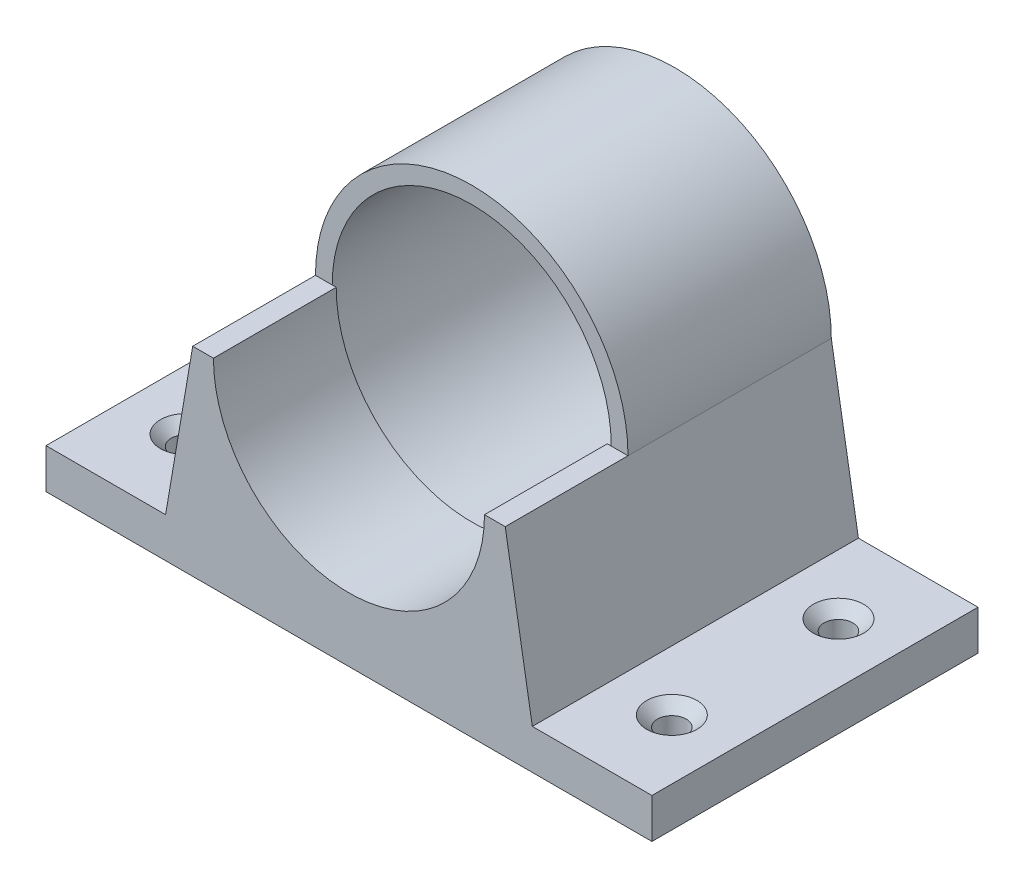
ISO-10303-21;
HEADER;
FILE_DESCRIPTION(('STEP AP214'),'2;1');
FILE_NAME('part.step','',(''),(''),'','','');
FILE_SCHEMA(('AUTOMOTIVE_DESIGN { 1 0 10303 214 1 1 1 1 }'));
ENDSEC;
DATA;
#1=APPLICATION_CONTEXT('core data for automotive mechanical design processes');
#2=APPLICATION_PROTOCOL_DEFINITION('international standard','automotive_design',2000,#1);
#3=PRODUCT_CONTEXT('',#1,'mechanical');
#4=PRODUCT('Part','Part','',(#3));
#5=PRODUCT_RELATED_PRODUCT_CATEGORY('part','',(#4));
#6=PRODUCT_DEFINITION_FORMATION('','',#4);
#7=PRODUCT_DEFINITION_CONTEXT('part definition',#1,'design');
#8=PRODUCT_DEFINITION('design','',#6,#7);
#9=PRODUCT_DEFINITION_SHAPE('','',#8);
#10=(LENGTH_UNIT() NAMED_UNIT(*) SI_UNIT(.MILLI.,.METRE.));
#11=(NAMED_UNIT(*) PLANE_ANGLE_UNIT() SI_UNIT($,.RADIAN.));
#12=(NAMED_UNIT(*) SI_UNIT($,.STERADIAN.) SOLID_ANGLE_UNIT());
#13=UNCERTAINTY_MEASURE_WITH_UNIT(LENGTH_MEASURE(1.E-05),#10,'distance_accuracy_value','');
#14=(GEOMETRIC_REPRESENTATION_CONTEXT(3) GLOBAL_UNCERTAINTY_ASSIGNED_CONTEXT((#13)) GLOBAL_UNIT_ASSIGNED_CONTEXT((#10,
#11,#12)) REPRESENTATION_CONTEXT('',''));
#15=CARTESIAN_POINT('',(0.,0.,0.));
#16=DIRECTION('',(0.,0.,1.));
#17=DIRECTION('',(1.,0.,0.));
#18=AXIS2_PLACEMENT_3D('',#15,#16,#17);
#19=CARTESIAN_POINT('',(0.,18.1533956791324,0.));
#20=DIRECTION('',(0.,0.,-1.));
#21=DIRECTION('',(-1.,0.,0.));
#22=AXIS2_PLACEMENT_3D('',#19,#20,#21);
#23=PLANE('',#22);
#24=CARTESIAN_POINT('',(0.,18.1533956791324,0.));
#25=DIRECTION('',(0.,0.,1.));
#26=DIRECTION('',(1.,0.,0.));
#27=AXIS2_PLACEMENT_3D('',#24,#25,#26);
#28=CIRCLE('',#27,17.5);
#29=CARTESIAN_POINT('',(17.5,18.1533956791324,0.));
#30=VERTEX_POINT('',#29);
#31=CARTESIAN_POINT('',(-17.5,18.1533956791324,0.));
#32=VERTEX_POINT('',#31);
#33=EDGE_CURVE('E225',#30,#32,#28,.T.);
#34=ORIENTED_EDGE('',*,*,#33,.F.);
#35=DIRECTION('',(1.,0.,0.));
#36=VECTOR('',#35,1.);
#37=CARTESIAN_POINT('',(0.,18.1533956791324,0.));
#38=LINE('',#37,#36);
#39=CARTESIAN_POINT('',(19.6,18.1533956791324,0.));
#40=VERTEX_POINT('',#39);
#41=EDGE_CURVE('E257',#30,#40,#38,.T.);
#42=ORIENTED_EDGE('',*,*,#41,.T.);
#43=CARTESIAN_POINT('',(0.,18.1533956791324,0.));
#44=DIRECTION('',(0.,0.,1.));
#45=DIRECTION('',(1.,0.,0.));
#46=AXIS2_PLACEMENT_3D('',#43,#44,#45);
#47=CIRCLE('',#46,19.6);
#48=CARTESIAN_POINT('',(-19.6,18.1533956791324,0.));
#49=VERTEX_POINT('',#48);
#50=EDGE_CURVE('E245',#40,#49,#47,.T.);
#51=ORIENTED_EDGE('',*,*,#50,.T.);
#52=DIRECTION('',(1.,0.,0.));
#53=VECTOR('',#52,1.);
#54=CARTESIAN_POINT('',(0.,18.1533956791324,0.));
#55=LINE('',#54,#53);
#56=EDGE_CURVE('E255',#49,#32,#55,.T.);
#57=ORIENTED_EDGE('',*,*,#56,.T.);
#58=EDGE_LOOP('',(#34,#42,#51,#57));
#59=FACE_BOUND('',#58,.T.);
#60=ADVANCED_FACE('F51',(#59),#23,.F.);
#61=CARTESIAN_POINT('',(0.,18.1533956791324,-25.5));
#62=DIRECTION('',(0.,0.,1.));
#63=DIRECTION('',(1.,0.,0.));
#64=AXIS2_PLACEMENT_3D('',#61,#62,#63);
#65=CYLINDRICAL_SURFACE('',#64,19.6);
#66=DIRECTION('',(0.,0.,-1.));
#67=VECTOR('',#66,1.);
#68=CARTESIAN_POINT('',(-19.6,18.1533956791324,15.4));
#69=LINE('',#68,#67);
#70=CARTESIAN_POINT('',(-19.6,18.1533956791324,-25.5));
#71=VERTEX_POINT('',#70);
#72=EDGE_CURVE('E226',#49,#71,#69,.T.);
#73=ORIENTED_EDGE('',*,*,#72,.F.);
#74=ORIENTED_EDGE('',*,*,#50,.F.);
#75=DIRECTION('',(0.,0.,-1.));
#76=VECTOR('',#75,1.);
#77=CARTESIAN_POINT('',(19.6,18.1533956791324,15.4));
#78=LINE('',#77,#76);
#79=CARTESIAN_POINT('',(19.6,18.1533956791324,-25.5));
#80=VERTEX_POINT('',#79);
#81=EDGE_CURVE('E222',#40,#80,#78,.T.);
#82=ORIENTED_EDGE('',*,*,#81,.T.);
#83=CARTESIAN_POINT('',(0.,18.1533956791324,-25.5));
#84=DIRECTION('',(0.,0.,-1.));
#85=DIRECTION('',(-1.,0.,0.));
#86=AXIS2_PLACEMENT_3D('',#83,#84,#85);
#87=CIRCLE('',#86,19.6);
#88=EDGE_CURVE('E154',#71,#80,#87,.T.);
#89=ORIENTED_EDGE('',*,*,#88,.F.);
#90=EDGE_LOOP('',(#73,#74,#82,#89));
#91=FACE_BOUND('',#90,.T.);
#92=ADVANCED_FACE('F53',(#91),#65,.T.);
#93=CARTESIAN_POINT('',(0.,18.1533956791324,-25.5));
#94=DIRECTION('',(0.,0.,-1.));
#95=DIRECTION('',(-1.,0.,0.));
#96=AXIS2_PLACEMENT_3D('',#93,#94,#95);
#97=PLANE('',#96);
#98=CARTESIAN_POINT('',(0.,18.1533956791324,-25.5));
#99=DIRECTION('',(0.,0.,1.));
#100=DIRECTION('',(1.,0.,0.));
#101=AXIS2_PLACEMENT_3D('',#98,#99,#100);
#102=CIRCLE('',#101,17.5);
#103=CARTESIAN_POINT('',(17.5,18.1533956791324,-25.5));
#104=VERTEX_POINT('',#103);
#105=EDGE_CURVE('E242',#104,#104,#102,.T.);
#106=ORIENTED_EDGE('',*,*,#105,.T.);
#107=EDGE_LOOP('',(#106));
#108=FACE_BOUND('',#107,.T.);
#109=ORIENTED_EDGE('',*,*,#88,.T.);
#110=DIRECTION('',(0.167595493933869,-0.985855846669817,0.));
#111=VECTOR('',#110,1.);
#112=CARTESIAN_POINT('',(19.6,18.1533956791324,-25.5));
#113=LINE('',#112,#111);
#114=CARTESIAN_POINT('',(23.,-1.84660432086758,-25.5));
#115=VERTEX_POINT('',#114);
#116=EDGE_CURVE('E184',#80,#115,#113,.T.);
#117=ORIENTED_EDGE('',*,*,#116,.T.);
#118=DIRECTION('',(1.,0.,0.));
#119=VECTOR('',#118,1.);
#120=CARTESIAN_POINT('',(23.,-1.84660432086758,-25.5));
#121=LINE('',#120,#119);
#122=CARTESIAN_POINT('',(38.,-1.84660432086758,-25.5));
#123=VERTEX_POINT('',#122);
#124=EDGE_CURVE('E187',#115,#123,#121,.T.);
#125=ORIENTED_EDGE('',*,*,#124,.T.);
#126=DIRECTION('',(0.,-1.,0.));
#127=VECTOR('',#126,1.);
#128=CARTESIAN_POINT('',(38.,-1.84660432086758,-25.5));
#129=LINE('',#128,#127);
#130=CARTESIAN_POINT('',(38.,-6.84660432086758,-25.5));
#131=VERTEX_POINT('',#130);
#132=EDGE_CURVE('E190',#123,#131,#129,.T.);
#133=ORIENTED_EDGE('',*,*,#132,.T.);
#134=DIRECTION('',(1.,0.,0.));
#135=VECTOR('',#134,1.);
#136=CARTESIAN_POINT('',(-38.,-6.84660432086758,-25.5));
#137=LINE('',#136,#135);
#138=CARTESIAN_POINT('',(-38.,-6.84660432086758,-25.5));
#139=VERTEX_POINT('',#138);
#140=EDGE_CURVE('E193',#139,#131,#137,.T.);
#141=ORIENTED_EDGE('',*,*,#140,.F.);
#142=DIRECTION('',(0.,-1.,0.));
#143=VECTOR('',#142,1.);
#144=CARTESIAN_POINT('',(-38.,-1.84660432086758,-25.5));
#145=LINE('',#144,#143);
#146=CARTESIAN_POINT('',(-38.,-1.84660432086758,-25.5));
#147=VERTEX_POINT('',#146);
#148=EDGE_CURVE('E196',#147,#139,#145,.T.);
#149=ORIENTED_EDGE('',*,*,#148,.F.);
#150=DIRECTION('',(-1.,0.,0.));
#151=VECTOR('',#150,1.);
#152=CARTESIAN_POINT('',(-23.,-1.84660432086758,-25.5));
#153=LINE('',#152,#151);
#154=CARTESIAN_POINT('',(-23.,-1.84660432086758,-25.5));
#155=VERTEX_POINT('',#154);
#156=EDGE_CURVE('E199',#155,#147,#153,.T.);
#157=ORIENTED_EDGE('',*,*,#156,.F.);
#158=DIRECTION('',(0.167595493933869,0.985855846669817,0.));
#159=VECTOR('',#158,1.);
#160=CARTESIAN_POINT('',(-23.,-1.84660432086758,-25.5));
#161=LINE('',#160,#159);
#162=EDGE_CURVE('E202',#155,#71,#161,.T.);
#163=ORIENTED_EDGE('',*,*,#162,.T.);
#164=EDGE_LOOP('',(#109,#117,#125,#133,#141,#149,#157,#163));
#165=FACE_BOUND('',#164,.T.);
#166=ADVANCED_FACE('F326',(#108,#165),#97,.T.);
#167=CARTESIAN_POINT('',(0.,18.1533956791324,-25.5));
#168=DIRECTION('',(0.,0.,1.));
#169=DIRECTION('',(1.,0.,0.));
#170=AXIS2_PLACEMENT_3D('',#167,#168,#169);
#171=CYLINDRICAL_SURFACE('',#170,17.5);
#172=ORIENTED_EDGE('',*,*,#105,.F.);
#173=EDGE_LOOP('',(#172));
#174=FACE_BOUND('',#173,.T.);
#175=ORIENTED_EDGE('',*,*,#33,.T.);
#176=CARTESIAN_POINT('',(0.,18.1533956791324,0.));
#177=DIRECTION('',(0.,0.,1.));
#178=DIRECTION('',(1.,0.,0.));
#179=AXIS2_PLACEMENT_3D('',#176,#177,#178);
#180=CIRCLE('',#179,17.5);
#181=EDGE_CURVE('E284',#30,#32,#180,.F.);
#182=ORIENTED_EDGE('',*,*,#181,.F.);
#183=EDGE_LOOP('',(#175,#182));
#184=FACE_BOUND('',#183,.T.);
#185=ADVANCED_FACE('F390',(#174,#184),#171,.F.);
#186=CARTESIAN_POINT('',(-23.,-1.84660432086758,15.4));
#187=DIRECTION('',(-0.985855846669818,0.167595493933869,0.));
#188=DIRECTION('',(-0.167595493933869,-0.985855846669818,0.));
#189=AXIS2_PLACEMENT_3D('',#186,#187,#188);
#190=PLANE('',#189);
#191=CARTESIAN_POINT('',(-19.6,18.1533956791324,15.4));
#192=VERTEX_POINT('',#191);
#193=EDGE_CURVE('E223',#192,#49,#69,.T.);
#194=ORIENTED_EDGE('',*,*,#193,.T.);
#195=ORIENTED_EDGE('',*,*,#72,.T.);
#196=ORIENTED_EDGE('',*,*,#162,.F.);
#197=DIRECTION('',(0.,0.,-1.));
#198=VECTOR('',#197,1.);
#199=CARTESIAN_POINT('',(-23.,-1.84660432086758,15.4));
#200=LINE('',#199,#198);
#201=CARTESIAN_POINT('',(-23.,-1.84660432086758,15.4));
#202=VERTEX_POINT('',#201);
#203=EDGE_CURVE('E227',#202,#155,#200,.T.);
#204=ORIENTED_EDGE('',*,*,#203,.F.);
#205=DIRECTION('',(0.167595493933869,0.985855846669817,0.));
#206=VECTOR('',#205,1.);
#207=CARTESIAN_POINT('',(-23.,-1.84660432086758,15.4));
#208=LINE('',#207,#206);
#209=EDGE_CURVE('E220',#202,#192,#208,.T.);
#210=ORIENTED_EDGE('',*,*,#209,.T.);
#211=EDGE_LOOP('',(#194,#195,#196,#204,#210));
#212=FACE_BOUND('',#211,.T.);
#213=ADVANCED_FACE('F313',(#212),#190,.T.);
#214=CARTESIAN_POINT('',(-23.,-1.84660432086758,15.4));
#215=DIRECTION('',(0.,-1.,0.));
#216=DIRECTION('',(1.,0.,0.));
#217=AXIS2_PLACEMENT_3D('',#214,#215,#216);
#218=PLANE('',#217);
#219=CARTESIAN_POINT('',(-30.5,-1.84660432086758,-15.5));
#220=DIRECTION('',(0.,1.,0.));
#221=DIRECTION('',(0.,0.,1.));
#222=AXIS2_PLACEMENT_3D('',#219,#220,#221);
#223=CIRCLE('',#222,3.15);
#224=CARTESIAN_POINT('',(-30.5,-1.84660432086758,-12.35));
#225=VERTEX_POINT('',#224);
#226=EDGE_CURVE('E175',#225,#225,#223,.T.);
#227=ORIENTED_EDGE('',*,*,#226,.F.);
#228=EDGE_LOOP('',(#227));
#229=FACE_BOUND('',#228,.T.);
#230=CARTESIAN_POINT('',(-30.5,-1.84660432086758,5.4));
#231=DIRECTION('',(0.,1.,0.));
#232=DIRECTION('',(0.,0.,1.));
#233=AXIS2_PLACEMENT_3D('',#230,#231,#232);
#234=CIRCLE('',#233,3.15);
#235=CARTESIAN_POINT('',(-30.5,-1.84660432086758,8.55));
#236=VERTEX_POINT('',#235);
#237=EDGE_CURVE('E168',#236,#236,#234,.T.);
#238=ORIENTED_EDGE('',*,*,#237,.F.);
#239=EDGE_LOOP('',(#238));
#240=FACE_BOUND('',#239,.T.);
#241=ORIENTED_EDGE('',*,*,#203,.T.);
#242=ORIENTED_EDGE('',*,*,#156,.T.);
#243=DIRECTION('',(0.,0.,-1.));
#244=VECTOR('',#243,1.);
#245=CARTESIAN_POINT('',(-38.,-1.84660432086758,15.4));
#246=LINE('',#245,#244);
#247=CARTESIAN_POINT('',(-38.,-1.84660432086758,15.4));
#248=VERTEX_POINT('',#247);
#249=EDGE_CURVE('E229',#248,#147,#246,.T.);
#250=ORIENTED_EDGE('',*,*,#249,.F.);
#251=DIRECTION('',(-1.,0.,0.));
#252=VECTOR('',#251,1.);
#253=CARTESIAN_POINT('',(-23.,-1.84660432086758,15.4));
#254=LINE('',#253,#252);
#255=EDGE_CURVE('E218',#202,#248,#254,.T.);
#256=ORIENTED_EDGE('',*,*,#255,.F.);
#257=EDGE_LOOP('',(#241,#242,#250,#256));
#258=FACE_BOUND('',#257,.T.);
#259=ADVANCED_FACE('F309',(#229,#240,#258),#218,.F.);
#260=CARTESIAN_POINT('',(-38.,-1.84660432086758,15.4));
#261=DIRECTION('',(1.,0.,0.));
#262=DIRECTION('',(0.,0.,-1.));
#263=AXIS2_PLACEMENT_3D('',#260,#261,#262);
#264=PLANE('',#263);
#265=ORIENTED_EDGE('',*,*,#249,.T.);
#266=ORIENTED_EDGE('',*,*,#148,.T.);
#267=DIRECTION('',(0.,0.,-1.));
#268=VECTOR('',#267,1.);
#269=CARTESIAN_POINT('',(-38.,-6.84660432086758,15.4));
#270=LINE('',#269,#268);
#271=CARTESIAN_POINT('',(-38.,-6.84660432086758,15.4));
#272=VERTEX_POINT('',#271);
#273=EDGE_CURVE('E231',#272,#139,#270,.T.);
#274=ORIENTED_EDGE('',*,*,#273,.F.);
#275=DIRECTION('',(0.,-1.,0.));
#276=VECTOR('',#275,1.);
#277=CARTESIAN_POINT('',(-38.,-1.84660432086758,15.4));
#278=LINE('',#277,#276);
#279=EDGE_CURVE('E216',#248,#272,#278,.T.);
#280=ORIENTED_EDGE('',*,*,#279,.F.);
#281=EDGE_LOOP('',(#265,#266,#274,#280));
#282=FACE_BOUND('',#281,.T.);
#283=ADVANCED_FACE('F312',(#282),#264,.F.);
#284=CARTESIAN_POINT('',(-38.,-6.84660432086758,15.4));
#285=DIRECTION('',(0.,1.,0.));
#286=DIRECTION('',(0.,0.,1.));
#287=AXIS2_PLACEMENT_3D('',#284,#285,#286);
#288=PLANE('',#287);
#289=CARTESIAN_POINT('',(30.5,-6.84660432086761,5.4));
#290=DIRECTION('',(0.,1.,0.));
#291=DIRECTION('',(0.,0.,1.));
#292=AXIS2_PLACEMENT_3D('',#289,#290,#291);
#293=CIRCLE('',#292,1.8);
#294=CARTESIAN_POINT('',(30.5,-6.84660432086761,7.2));
#295=VERTEX_POINT('',#294);
#296=EDGE_CURVE('E293',#295,#295,#293,.T.);
#297=ORIENTED_EDGE('',*,*,#296,.T.);
#298=EDGE_LOOP('',(#297));
#299=FACE_BOUND('',#298,.T.);
#300=CARTESIAN_POINT('',(30.5,-6.84660432086761,-15.5));
#301=DIRECTION('',(0.,1.,0.));
#302=DIRECTION('',(0.,0.,1.));
#303=AXIS2_PLACEMENT_3D('',#300,#301,#302);
#304=CIRCLE('',#303,1.8);
#305=CARTESIAN_POINT('',(30.5,-6.84660432086761,-13.7));
#306=VERTEX_POINT('',#305);
#307=EDGE_CURVE('E302',#306,#306,#304,.T.);
#308=ORIENTED_EDGE('',*,*,#307,.T.);
#309=EDGE_LOOP('',(#308));
#310=FACE_BOUND('',#309,.T.);
#311=CARTESIAN_POINT('',(-30.5,-6.8466043208676,-15.5));
#312=DIRECTION('',(0.,1.,0.));
#313=DIRECTION('',(0.,0.,1.));
#314=AXIS2_PLACEMENT_3D('',#311,#312,#313);
#315=CIRCLE('',#314,1.8);
#316=CARTESIAN_POINT('',(-31.6901796266558,-6.84660432081886,-14.1496398790347));
#317=VERTEX_POINT('',#316);
#318=CARTESIAN_POINT('',(-31.7573023830465,-6.8466043208676,-16.7880957718995));
#319=VERTEX_POINT('',#318);
#320=EDGE_CURVE('E163',#317,#319,#315,.T.);
#321=ORIENTED_EDGE('',*,*,#320,.T.);
#322=CARTESIAN_POINT('',(-32.9482803004892,-6.84660432086758,-15.4377153410314));
#323=DIRECTION('',(0.,1.,0.));
#324=DIRECTION('',(0.999676555950965,0.,-0.0254319382276887));
#325=AXIS2_PLACEMENT_3D('',#322,#323,#324);
#326=ELLIPSE('',#325,1.80117420355769,1.79999999999999);
#327=EDGE_CURVE('E158',#319,#317,#326,.T.);
#328=ORIENTED_EDGE('',*,*,#327,.T.);
#329=EDGE_LOOP('',(#321,#328));
#330=FACE_BOUND('',#329,.T.);
#331=CARTESIAN_POINT('',(-30.5,-6.8466043208676,5.4));
#332=DIRECTION('',(0.,1.,0.));
#333=DIRECTION('',(0.,0.,1.));
#334=AXIS2_PLACEMENT_3D('',#331,#332,#333);
#335=CIRCLE('',#334,1.8);
#336=CARTESIAN_POINT('',(-31.150132470735,-6.84660432081886,7.07848972904097));
#337=VERTEX_POINT('',#336);
#338=CARTESIAN_POINT('',(-31.2346383598517,-6.8466043208676,3.75673907116536));
#339=VERTEX_POINT('',#338);
#340=EDGE_CURVE('E181',#337,#339,#335,.T.);
#341=ORIENTED_EDGE('',*,*,#340,.T.);
#342=CARTESIAN_POINT('',(-31.885222499378,-6.84660432086758,5.43524029129845));
#343=DIRECTION('',(0.,1.,0.));
#344=DIRECTION('',(0.999676555950965,0.,-0.0254319382276887));
#345=AXIS2_PLACEMENT_3D('',#342,#343,#344);
#346=ELLIPSE('',#345,1.80117420355771,1.8);
#347=EDGE_CURVE('E164',#339,#337,#346,.T.);
#348=ORIENTED_EDGE('',*,*,#347,.T.);
#349=EDGE_LOOP('',(#341,#348));
#350=FACE_BOUND('',#349,.T.);
#351=ORIENTED_EDGE('',*,*,#273,.T.);
#352=ORIENTED_EDGE('',*,*,#140,.T.);
#353=DIRECTION('',(0.,0.,-1.));
#354=VECTOR('',#353,1.);
#355=CARTESIAN_POINT('',(38.,-6.84660432086758,15.4));
#356=LINE('',#355,#354);
#357=CARTESIAN_POINT('',(38.,-6.84660432086758,15.4));
#358=VERTEX_POINT('',#357);
#359=EDGE_CURVE('E233',#358,#131,#356,.T.);
#360=ORIENTED_EDGE('',*,*,#359,.F.);
#361=DIRECTION('',(1.,0.,0.));
#362=VECTOR('',#361,1.);
#363=CARTESIAN_POINT('',(-38.,-6.84660432086758,15.4));
#364=LINE('',#363,#362);
#365=EDGE_CURVE('E214',#272,#358,#364,.T.);
#366=ORIENTED_EDGE('',*,*,#365,.F.);
#367=EDGE_LOOP('',(#351,#352,#360,#366));
#368=FACE_BOUND('',#367,.T.);
#369=ADVANCED_FACE('F161',(#299,#310,#330,#350,#368),#288,.F.);
#370=CARTESIAN_POINT('',(38.,-1.84660432086758,15.4));
#371=DIRECTION('',(1.,0.,0.));
#372=DIRECTION('',(0.,0.,-1.));
#373=AXIS2_PLACEMENT_3D('',#370,#371,#372);
#374=PLANE('',#373);
#375=ORIENTED_EDGE('',*,*,#359,.T.);
#376=ORIENTED_EDGE('',*,*,#132,.F.);
#377=DIRECTION('',(0.,0.,-1.));
#378=VECTOR('',#377,1.);
#379=CARTESIAN_POINT('',(38.,-1.84660432086758,15.4));
#380=LINE('',#379,#378);
#381=CARTESIAN_POINT('',(38.,-1.84660432086758,15.4));
#382=VERTEX_POINT('',#381);
#383=EDGE_CURVE('E235',#382,#123,#380,.T.);
#384=ORIENTED_EDGE('',*,*,#383,.F.);
#385=DIRECTION('',(0.,-1.,0.));
#386=VECTOR('',#385,1.);
#387=CARTESIAN_POINT('',(38.,-1.84660432086758,15.4));
#388=LINE('',#387,#386);
#389=EDGE_CURVE('E211',#382,#358,#388,.T.);
#390=ORIENTED_EDGE('',*,*,#389,.T.);
#391=EDGE_LOOP('',(#375,#376,#384,#390));
#392=FACE_BOUND('',#391,.T.);
#393=ADVANCED_FACE('F343',(#392),#374,.T.);
#394=CARTESIAN_POINT('',(23.,-1.84660432086758,15.4));
#395=DIRECTION('',(0.,1.,0.));
#396=DIRECTION('',(-1.,0.,0.));
#397=AXIS2_PLACEMENT_3D('',#394,#395,#396);
#398=PLANE('',#397);
#399=CARTESIAN_POINT('',(30.5,-1.84660432086758,5.4));
#400=DIRECTION('',(0.,1.,0.));
#401=DIRECTION('',(0.,0.,1.));
#402=AXIS2_PLACEMENT_3D('',#399,#400,#401);
#403=CIRCLE('',#402,3.15);
#404=CARTESIAN_POINT('',(30.5,-1.84660432086758,8.55));
#405=VERTEX_POINT('',#404);
#406=EDGE_CURVE('E287',#405,#405,#403,.T.);
#407=ORIENTED_EDGE('',*,*,#406,.F.);
#408=EDGE_LOOP('',(#407));
#409=FACE_BOUND('',#408,.T.);
#410=CARTESIAN_POINT('',(30.5,-1.84660432086758,-15.5));
#411=DIRECTION('',(0.,1.,0.));
#412=DIRECTION('',(0.,0.,1.));
#413=AXIS2_PLACEMENT_3D('',#410,#411,#412);
#414=CIRCLE('',#413,3.15);
#415=CARTESIAN_POINT('',(30.5,-1.84660432086758,-12.35));
#416=VERTEX_POINT('',#415);
#417=EDGE_CURVE('E296',#416,#416,#414,.T.);
#418=ORIENTED_EDGE('',*,*,#417,.F.);
#419=EDGE_LOOP('',(#418));
#420=FACE_BOUND('',#419,.T.);
#421=ORIENTED_EDGE('',*,*,#383,.T.);
#422=ORIENTED_EDGE('',*,*,#124,.F.);
#423=DIRECTION('',(0.,0.,-1.));
#424=VECTOR('',#423,1.);
#425=CARTESIAN_POINT('',(23.,-1.84660432086758,15.4));
#426=LINE('',#425,#424);
#427=CARTESIAN_POINT('',(23.,-1.84660432086758,15.4));
#428=VERTEX_POINT('',#427);
#429=EDGE_CURVE('E237',#428,#115,#426,.T.);
#430=ORIENTED_EDGE('',*,*,#429,.F.);
#431=DIRECTION('',(1.,0.,0.));
#432=VECTOR('',#431,1.);
#433=CARTESIAN_POINT('',(23.,-1.84660432086758,15.4));
#434=LINE('',#433,#432);
#435=EDGE_CURVE('E208',#428,#382,#434,.T.);
#436=ORIENTED_EDGE('',*,*,#435,.T.);
#437=EDGE_LOOP('',(#421,#422,#430,#436));
#438=FACE_BOUND('',#437,.T.);
#439=ADVANCED_FACE('F340',(#409,#420,#438),#398,.T.);
#440=CARTESIAN_POINT('',(19.6,18.1533956791324,15.4));
#441=DIRECTION('',(0.985855846669818,0.167595493933869,0.));
#442=DIRECTION('',(-0.167595493933869,0.985855846669818,0.));
#443=AXIS2_PLACEMENT_3D('',#440,#441,#442);
#444=PLANE('',#443);
#445=ORIENTED_EDGE('',*,*,#429,.T.);
#446=ORIENTED_EDGE('',*,*,#116,.F.);
#447=ORIENTED_EDGE('',*,*,#81,.F.);
#448=CARTESIAN_POINT('',(19.6,18.1533956791324,15.4));
#449=VERTEX_POINT('',#448);
#450=EDGE_CURVE('E239',#449,#40,#78,.T.);
#451=ORIENTED_EDGE('',*,*,#450,.F.);
#452=DIRECTION('',(0.167595493933869,-0.985855846669817,0.));
#453=VECTOR('',#452,1.);
#454=CARTESIAN_POINT('',(19.6,18.1533956791324,15.4));
#455=LINE('',#454,#453);
#456=EDGE_CURVE('E205',#449,#428,#455,.T.);
#457=ORIENTED_EDGE('',*,*,#456,.T.);
#458=EDGE_LOOP('',(#445,#446,#447,#451,#457));
#459=FACE_BOUND('',#458,.T.);
#460=ADVANCED_FACE('F346',(#459),#444,.T.);
#461=CARTESIAN_POINT('',(0.,18.1533956791324,15.4));
#462=DIRECTION('',(0.,0.,1.));
#463=DIRECTION('',(1.,0.,0.));
#464=AXIS2_PLACEMENT_3D('',#461,#462,#463);
#465=PLANE('',#464);
#466=ORIENTED_EDGE('',*,*,#456,.F.);
#467=DIRECTION('',(1.,0.,0.));
#468=VECTOR('',#467,1.);
#469=CARTESIAN_POINT('',(0.,18.1533956791324,15.4));
#470=LINE('',#469,#468);
#471=CARTESIAN_POINT('',(17.,18.1533956791324,15.4));
#472=VERTEX_POINT('',#471);
#473=EDGE_CURVE('E270',#472,#449,#470,.T.);
#474=ORIENTED_EDGE('',*,*,#473,.F.);
#475=CARTESIAN_POINT('',(0.,18.1533956791324,15.4));
#476=DIRECTION('',(0.,0.,1.));
#477=DIRECTION('',(1.,0.,0.));
#478=AXIS2_PLACEMENT_3D('',#475,#476,#477);
#479=CIRCLE('',#478,17.);
#480=CARTESIAN_POINT('',(-17.,18.1533956791324,15.4));
#481=VERTEX_POINT('',#480);
#482=EDGE_CURVE('E273',#472,#481,#479,.F.);
#483=ORIENTED_EDGE('',*,*,#482,.T.);
#484=DIRECTION('',(1.,0.,0.));
#485=VECTOR('',#484,1.);
#486=CARTESIAN_POINT('',(0.,18.1533956791324,15.4));
#487=LINE('',#486,#485);
#488=EDGE_CURVE('E282',#192,#481,#487,.T.);
#489=ORIENTED_EDGE('',*,*,#488,.F.);
#490=ORIENTED_EDGE('',*,*,#209,.F.);
#491=ORIENTED_EDGE('',*,*,#255,.T.);
#492=ORIENTED_EDGE('',*,*,#279,.T.);
#493=ORIENTED_EDGE('',*,*,#365,.T.);
#494=ORIENTED_EDGE('',*,*,#389,.F.);
#495=ORIENTED_EDGE('',*,*,#435,.F.);
#496=EDGE_LOOP('',(#466,#474,#483,#489,#490,#491,#492,#493,#494,#495));
#497=FACE_BOUND('',#496,.T.);
#498=ADVANCED_FACE('F333',(#497),#465,.T.);
#499=CARTESIAN_POINT('',(-30.5,-1.84660432086758,5.4));
#500=DIRECTION('',(0.,1.,0.));
#501=DIRECTION('',(0.,0.,1.));
#502=AXIS2_PLACEMENT_3D('',#499,#500,#501);
#503=CYLINDRICAL_SURFACE('',#502,1.8);
#504=ORIENTED_EDGE('',*,*,#340,.F.);
#505=CARTESIAN_POINT('',(-30.5,-6.87162560873723,5.4));
#506=DIRECTION('',(0.0360908865319125,0.999348089954104,-0.000918158169658168));
#507=DIRECTION('',(-0.999024856761494,0.0361025636912934,0.0254153588916714));
#508=AXIS2_PLACEMENT_3D('',#505,#506,#507);
#509=ELLIPSE('',#508,1.80117420355771,1.8);
#510=EDGE_CURVE('E12',#337,#339,#509,.F.);
#511=ORIENTED_EDGE('',*,*,#510,.T.);
#512=EDGE_LOOP('',(#504,#511));
#513=FACE_BOUND('',#512,.T.);
#514=CARTESIAN_POINT('',(-30.5,-3.19660432086758,5.4));
#515=DIRECTION('',(0.,1.,0.));
#516=DIRECTION('',(0.,0.,1.));
#517=AXIS2_PLACEMENT_3D('',#514,#515,#516);
#518=CIRCLE('',#517,1.8);
#519=CARTESIAN_POINT('',(-30.5,-3.19660432086758,7.2));
#520=VERTEX_POINT('',#519);
#521=EDGE_CURVE('E172',#520,#520,#518,.T.);
#522=ORIENTED_EDGE('',*,*,#521,.T.);
#523=EDGE_LOOP('',(#522));
#524=FACE_BOUND('',#523,.T.);
#525=ADVANCED_FACE('F368',(#513,#524),#503,.F.);
#526=CARTESIAN_POINT('',(-30.5,-1.84660432086758,5.4));
#527=DIRECTION('',(0.,1.,0.));
#528=DIRECTION('',(0.,0.,1.));
#529=AXIS2_PLACEMENT_3D('',#526,#527,#528);
#530=CONICAL_SURFACE('',#529,3.15,0.785398163397448);
#531=ORIENTED_EDGE('',*,*,#521,.F.);
#532=EDGE_LOOP('',(#531));
#533=FACE_BOUND('',#532,.T.);
#534=ORIENTED_EDGE('',*,*,#237,.T.);
#535=EDGE_LOOP('',(#534));
#536=FACE_BOUND('',#535,.T.);
#537=ADVANCED_FACE('F428',(#533,#536),#530,.F.);
#538=CARTESIAN_POINT('',(-30.5,-1.84660432086758,-15.5));
#539=DIRECTION('',(0.,1.,0.));
#540=DIRECTION('',(0.,0.,1.));
#541=AXIS2_PLACEMENT_3D('',#538,#539,#540);
#542=CYLINDRICAL_SURFACE('',#541,1.8);
#543=ORIENTED_EDGE('',*,*,#320,.F.);
#544=CARTESIAN_POINT('',(-30.5,-6.89082763247526,-15.5));
#545=DIRECTION('',(0.0360908865319125,0.999348089954104,-0.000918158169658168));
#546=DIRECTION('',(-0.999024856761494,0.0361025636912934,0.0254153588916714));
#547=AXIS2_PLACEMENT_3D('',#544,#545,#546);
#548=ELLIPSE('',#547,1.80117420355771,1.8);
#549=EDGE_CURVE('E59',#317,#319,#548,.F.);
#550=ORIENTED_EDGE('',*,*,#549,.T.);
#551=EDGE_LOOP('',(#543,#550));
#552=FACE_BOUND('',#551,.T.);
#553=CARTESIAN_POINT('',(-30.5,-3.19660432086758,-15.5));
#554=DIRECTION('',(0.,1.,0.));
#555=DIRECTION('',(0.,0.,1.));
#556=AXIS2_PLACEMENT_3D('',#553,#554,#555);
#557=CIRCLE('',#556,1.8);
#558=CARTESIAN_POINT('',(-30.5,-3.19660432086758,-13.7));
#559=VERTEX_POINT('',#558);
#560=EDGE_CURVE('E169',#559,#559,#557,.T.);
#561=ORIENTED_EDGE('',*,*,#560,.T.);
#562=EDGE_LOOP('',(#561));
#563=FACE_BOUND('',#562,.T.);
#564=ADVANCED_FACE('F166',(#552,#563),#542,.F.);
#565=CARTESIAN_POINT('',(-30.5,-1.84660432086758,-15.5));
#566=DIRECTION('',(0.,1.,0.));
#567=DIRECTION('',(0.,0.,1.));
#568=AXIS2_PLACEMENT_3D('',#565,#566,#567);
#569=CONICAL_SURFACE('',#568,3.15,0.785398163397448);
#570=ORIENTED_EDGE('',*,*,#560,.F.);
#571=EDGE_LOOP('',(#570));
#572=FACE_BOUND('',#571,.T.);
#573=ORIENTED_EDGE('',*,*,#226,.T.);
#574=EDGE_LOOP('',(#573));
#575=FACE_BOUND('',#574,.T.);
#576=ADVANCED_FACE('F307',(#572,#575),#569,.F.);
#577=CARTESIAN_POINT('',(30.5,-1.84660432086758,-15.5));
#578=DIRECTION('',(0.,1.,0.));
#579=DIRECTION('',(0.,0.,1.));
#580=AXIS2_PLACEMENT_3D('',#577,#578,#579);
#581=CYLINDRICAL_SURFACE('',#580,1.79999999999999);
#582=ORIENTED_EDGE('',*,*,#307,.F.);
#583=EDGE_LOOP('',(#582));
#584=FACE_BOUND('',#583,.T.);
#585=CARTESIAN_POINT('',(30.5,-3.19660432086759,-15.5));
#586=DIRECTION('',(0.,1.,0.));
#587=DIRECTION('',(0.,0.,1.));
#588=AXIS2_PLACEMENT_3D('',#585,#586,#587);
#589=CIRCLE('',#588,1.79999999999999);
#590=CARTESIAN_POINT('',(30.5,-3.19660432086759,-13.7));
#591=VERTEX_POINT('',#590);
#592=EDGE_CURVE('E299',#591,#591,#589,.T.);
#593=ORIENTED_EDGE('',*,*,#592,.T.);
#594=EDGE_LOOP('',(#593));
#595=FACE_BOUND('',#594,.T.);
#596=ADVANCED_FACE('F408',(#584,#595),#581,.F.);
#597=CARTESIAN_POINT('',(30.5,-1.84660432086758,-15.5));
#598=DIRECTION('',(0.,1.,0.));
#599=DIRECTION('',(0.,0.,1.));
#600=AXIS2_PLACEMENT_3D('',#597,#598,#599);
#601=CONICAL_SURFACE('',#600,3.15,0.78539816339745);
#602=ORIENTED_EDGE('',*,*,#592,.F.);
#603=EDGE_LOOP('',(#602));
#604=FACE_BOUND('',#603,.T.);
#605=ORIENTED_EDGE('',*,*,#417,.T.);
#606=EDGE_LOOP('',(#605));
#607=FACE_BOUND('',#606,.T.);
#608=ADVANCED_FACE('F405',(#604,#607),#601,.F.);
#609=CARTESIAN_POINT('',(30.5,-1.84660432086758,5.4));
#610=DIRECTION('',(0.,1.,0.));
#611=DIRECTION('',(0.,0.,1.));
#612=AXIS2_PLACEMENT_3D('',#609,#610,#611);
#613=CYLINDRICAL_SURFACE('',#612,1.79999999999999);
#614=ORIENTED_EDGE('',*,*,#296,.F.);
#615=EDGE_LOOP('',(#614));
#616=FACE_BOUND('',#615,.T.);
#617=CARTESIAN_POINT('',(30.5,-3.19660432086759,5.4));
#618=DIRECTION('',(0.,1.,0.));
#619=DIRECTION('',(0.,0.,1.));
#620=AXIS2_PLACEMENT_3D('',#617,#618,#619);
#621=CIRCLE('',#620,1.79999999999999);
#622=CARTESIAN_POINT('',(30.5,-3.19660432086759,7.19999999999998));
#623=VERTEX_POINT('',#622);
#624=EDGE_CURVE('E290',#623,#623,#621,.T.);
#625=ORIENTED_EDGE('',*,*,#624,.T.);
#626=EDGE_LOOP('',(#625));
#627=FACE_BOUND('',#626,.T.);
#628=ADVANCED_FACE('F407',(#616,#627),#613,.F.);
#629=CARTESIAN_POINT('',(30.5,-1.84660432086758,5.4));
#630=DIRECTION('',(0.,1.,0.));
#631=DIRECTION('',(0.,0.,1.));
#632=AXIS2_PLACEMENT_3D('',#629,#630,#631);
#633=CONICAL_SURFACE('',#632,3.15,0.785398163397453);
#634=ORIENTED_EDGE('',*,*,#624,.F.);
#635=EDGE_LOOP('',(#634));
#636=FACE_BOUND('',#635,.T.);
#637=ORIENTED_EDGE('',*,*,#406,.T.);
#638=EDGE_LOOP('',(#637));
#639=FACE_BOUND('',#638,.T.);
#640=ADVANCED_FACE('F415',(#636,#639),#633,.F.);
#641=CARTESIAN_POINT('',(0.,0.,0.));
#642=DIRECTION('',(0.,0.,1.));
#643=DIRECTION('',(1.,0.,0.));
#644=AXIS2_PLACEMENT_3D('',#641,#642,#643);
#645=PLANE('',#644);
#646=CARTESIAN_POINT('',(17.,18.1533956791324,0.));
#647=VERTEX_POINT('',#646);
#648=EDGE_CURVE('E358',#647,#30,#38,.T.);
#649=ORIENTED_EDGE('',*,*,#648,.T.);
#650=ORIENTED_EDGE('',*,*,#181,.T.);
#651=CARTESIAN_POINT('',(-17.,18.1533956791324,0.));
#652=VERTEX_POINT('',#651);
#653=EDGE_CURVE('E269',#32,#652,#55,.T.);
#654=ORIENTED_EDGE('',*,*,#653,.T.);
#655=CARTESIAN_POINT('',(0.,18.1533956791324,0.));
#656=DIRECTION('',(0.,0.,1.));
#657=DIRECTION('',(1.,0.,0.));
#658=AXIS2_PLACEMENT_3D('',#655,#656,#657);
#659=CIRCLE('',#658,17.);
#660=EDGE_CURVE('E275',#647,#652,#659,.F.);
#661=ORIENTED_EDGE('',*,*,#660,.F.);
#662=EDGE_LOOP('',(#649,#650,#654,#661));
#663=FACE_BOUND('',#662,.T.);
#664=ADVANCED_FACE('F542',(#663),#645,.F.);
#665=CARTESIAN_POINT('',(0.,18.1533956791324,15.4));
#666=DIRECTION('',(0.,1.,0.));
#667=DIRECTION('',(0.,0.,1.));
#668=AXIS2_PLACEMENT_3D('',#665,#666,#667);
#669=PLANE('',#668);
#670=ORIENTED_EDGE('',*,*,#648,.F.);
#671=DIRECTION('',(0.,0.,-1.));
#672=VECTOR('',#671,1.);
#673=CARTESIAN_POINT('',(17.,18.1533956791324,15.4));
#674=LINE('',#673,#672);
#675=EDGE_CURVE('E281',#472,#647,#674,.T.);
#676=ORIENTED_EDGE('',*,*,#675,.F.);
#677=ORIENTED_EDGE('',*,*,#473,.T.);
#678=ORIENTED_EDGE('',*,*,#450,.T.);
#679=ORIENTED_EDGE('',*,*,#41,.F.);
#680=EDGE_LOOP('',(#670,#676,#677,#678,#679));
#681=FACE_BOUND('',#680,.T.);
#682=ADVANCED_FACE('F349',(#681),#669,.T.);
#683=CARTESIAN_POINT('',(0.,18.1533956791324,15.4));
#684=DIRECTION('',(0.,0.,-1.));
#685=DIRECTION('',(-1.,0.,0.));
#686=AXIS2_PLACEMENT_3D('',#683,#684,#685);
#687=CYLINDRICAL_SURFACE('',#686,17.);
#688=ORIENTED_EDGE('',*,*,#660,.T.);
#689=DIRECTION('',(0.,0.,-1.));
#690=VECTOR('',#689,1.);
#691=CARTESIAN_POINT('',(-17.,18.1533956791324,15.4));
#692=LINE('',#691,#690);
#693=EDGE_CURVE('E279',#481,#652,#692,.T.);
#694=ORIENTED_EDGE('',*,*,#693,.F.);
#695=ORIENTED_EDGE('',*,*,#482,.F.);
#696=ORIENTED_EDGE('',*,*,#675,.T.);
#697=EDGE_LOOP('',(#688,#694,#695,#696));
#698=FACE_BOUND('',#697,.T.);
#699=ADVANCED_FACE('F355',(#698),#687,.F.);
#700=CARTESIAN_POINT('',(0.,18.1533956791324,15.4));
#701=DIRECTION('',(0.,1.,0.));
#702=DIRECTION('',(0.,0.,1.));
#703=AXIS2_PLACEMENT_3D('',#700,#701,#702);
#704=PLANE('',#703);
#705=ORIENTED_EDGE('',*,*,#56,.F.);
#706=ORIENTED_EDGE('',*,*,#193,.F.);
#707=ORIENTED_EDGE('',*,*,#488,.T.);
#708=ORIENTED_EDGE('',*,*,#693,.T.);
#709=ORIENTED_EDGE('',*,*,#653,.F.);
#710=EDGE_LOOP('',(#705,#706,#707,#708,#709));
#711=FACE_BOUND('',#710,.T.);
#712=ADVANCED_FACE('F265',(#711),#704,.T.);
#713=CARTESIAN_POINT('',(-33.3046036567288,-16.7131135613431,-15.4286504154502));
#714=DIRECTION('',(0.0360908865319125,0.999348089954104,-0.000918158169658168));
#715=DIRECTION('',(-0.999348511186798,0.0360909017444911,0.));
#716=AXIS2_PLACEMENT_3D('',#713,#714,#715);
#717=CYLINDRICAL_SURFACE('',#716,1.79999999999999);
#718=CARTESIAN_POINT('',(-32.9466842419644,-6.80240983878358,-15.4377559450264));
#719=DIRECTION('',(0.0360908865319125,0.999348089954104,-0.000918158169658168));
#720=DIRECTION('',(-0.999348511186798,0.0360909017444911,0.));
#721=AXIS2_PLACEMENT_3D('',#718,#719,#720);
#722=CIRCLE('',#721,1.79999999999999);
#723=EDGE_CURVE('E72',#319,#317,#722,.T.);
#724=ORIENTED_EDGE('',*,*,#723,.T.);
#725=ORIENTED_EDGE('',*,*,#327,.F.);
#726=EDGE_LOOP('',(#724,#725));
#727=FACE_BOUND('',#726,.T.);
#728=ADVANCED_FACE('F157',(#727),#717,.F.);
#729=CARTESIAN_POINT('',(-32.9466842419644,-6.80240983878358,-15.4377559450264));
#730=DIRECTION('',(0.0360908865319125,0.999348089954104,-0.000918158169658168));
#731=DIRECTION('',(-0.999348511186798,0.0360909017444911,0.));
#732=AXIS2_PLACEMENT_3D('',#729,#730,#731);
#733=PLANE('',#732);
#734=ORIENTED_EDGE('',*,*,#723,.F.);
#735=ORIENTED_EDGE('',*,*,#549,.F.);
#736=EDGE_LOOP('',(#734,#735));
#737=FACE_BOUND('',#736,.T.);
#738=ADVANCED_FACE('F150',(#737),#733,.F.);
#739=CARTESIAN_POINT('',(-32.2422388736775,-16.732303067089,5.44432284737462));
#740=DIRECTION('',(0.0360908865319125,0.999348089954104,-0.000918158169658168));
#741=DIRECTION('',(-0.999348511186798,0.0360909017444911,0.));
#742=AXIS2_PLACEMENT_3D('',#739,#740,#741);
#743=CYLINDRICAL_SURFACE('',#742,1.8);
#744=CARTESIAN_POINT('',(-31.8843194589131,-6.82159934452943,5.43521731779849));
#745=DIRECTION('',(0.0360908865319125,0.999348089954104,-0.000918158169658168));
#746=DIRECTION('',(-0.999348511186798,0.0360909017444911,0.));
#747=AXIS2_PLACEMENT_3D('',#744,#745,#746);
#748=CIRCLE('',#747,1.8);
#749=EDGE_CURVE('E65',#339,#337,#748,.T.);
#750=ORIENTED_EDGE('',*,*,#749,.T.);
#751=ORIENTED_EDGE('',*,*,#347,.F.);
#752=EDGE_LOOP('',(#750,#751));
#753=FACE_BOUND('',#752,.T.);
#754=ADVANCED_FACE('F366',(#753),#743,.F.);
#755=CARTESIAN_POINT('',(-31.8843194589131,-6.82159934452943,5.43521731779849));
#756=DIRECTION('',(0.0360908865319125,0.999348089954104,-0.000918158169658168));
#757=DIRECTION('',(-0.999348511186798,0.0360909017444911,0.));
#758=AXIS2_PLACEMENT_3D('',#755,#756,#757);
#759=PLANE('',#758);
#760=ORIENTED_EDGE('',*,*,#749,.F.);
#761=ORIENTED_EDGE('',*,*,#510,.F.);
#762=EDGE_LOOP('',(#760,#761));
#763=FACE_BOUND('',#762,.T.);
#764=ADVANCED_FACE('F606',(#763),#759,.F.);
#765=CLOSED_SHELL('',(#60,#92,#166,#185,#213,#259,#283,#369,#393,#439,#460,#498,#525,#537,#564,
#576,#596,#608,#628,#640,#664,#682,#699,#712,#728,#738,#754,#764));
#766=MANIFOLD_SOLID_BREP('B2',#765);
#767=ADVANCED_BREP_SHAPE_REPRESENTATION('',(#18,#766),#14);
#768=SHAPE_DEFINITION_REPRESENTATION(#9,#767);
ENDSEC;
END-ISO-10303-21;
